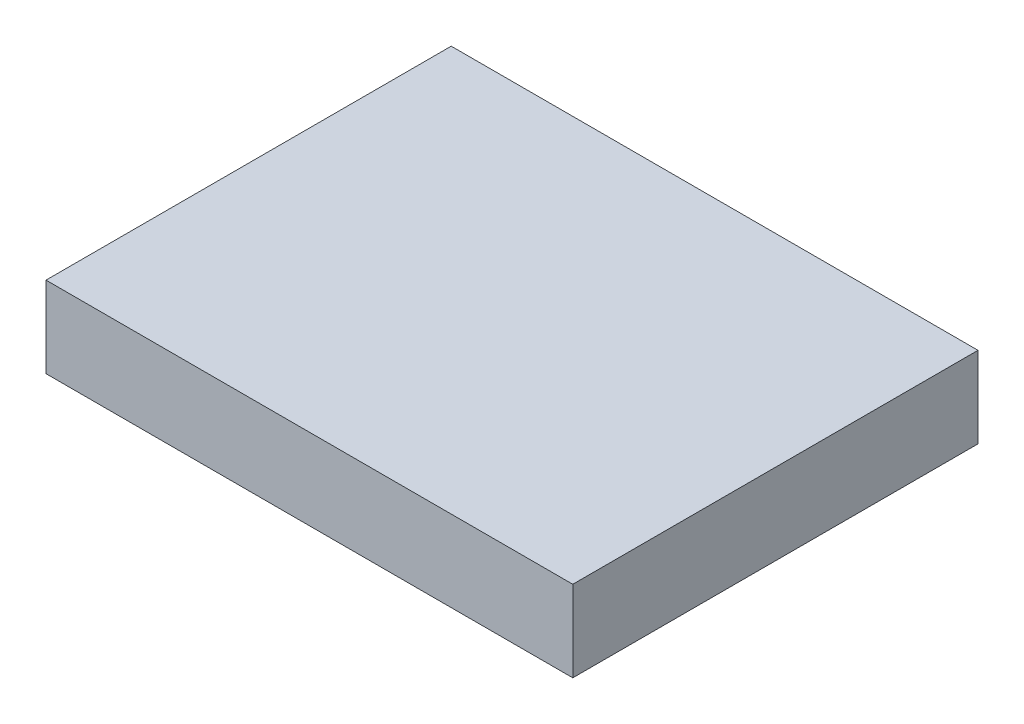
ISO-10303-21;
HEADER;
FILE_DESCRIPTION(('STEP AP214'),'2;1');
FILE_NAME('part.step','',(''),(''),'','','');
FILE_SCHEMA(('AUTOMOTIVE_DESIGN { 1 0 10303 214 1 1 1 1 }'));
ENDSEC;
DATA;
#1=APPLICATION_CONTEXT('core data for automotive mechanical design processes');
#2=APPLICATION_PROTOCOL_DEFINITION('international standard','automotive_design',2000,#1);
#3=PRODUCT_CONTEXT('',#1,'mechanical');
#4=PRODUCT('Part','Part','',(#3));
#5=PRODUCT_RELATED_PRODUCT_CATEGORY('part','',(#4));
#6=PRODUCT_DEFINITION_FORMATION('','',#4);
#7=PRODUCT_DEFINITION_CONTEXT('part definition',#1,'design');
#8=PRODUCT_DEFINITION('design','',#6,#7);
#9=PRODUCT_DEFINITION_SHAPE('','',#8);
#10=(LENGTH_UNIT() NAMED_UNIT(*) SI_UNIT(.MILLI.,.METRE.));
#11=(NAMED_UNIT(*) PLANE_ANGLE_UNIT() SI_UNIT($,.RADIAN.));
#12=(NAMED_UNIT(*) SI_UNIT($,.STERADIAN.) SOLID_ANGLE_UNIT());
#13=UNCERTAINTY_MEASURE_WITH_UNIT(LENGTH_MEASURE(1.E-05),#10,'distance_accuracy_value','');
#14=(GEOMETRIC_REPRESENTATION_CONTEXT(3) GLOBAL_UNCERTAINTY_ASSIGNED_CONTEXT((#13)) GLOBAL_UNIT_ASSIGNED_CONTEXT((#10,
#11,#12)) REPRESENTATION_CONTEXT('',''));
#15=CARTESIAN_POINT('',(0.,0.,0.));
#16=DIRECTION('',(0.,0.,1.));
#17=DIRECTION('',(1.,0.,0.));
#18=AXIS2_PLACEMENT_3D('',#15,#16,#17);
#19=CARTESIAN_POINT('',(0.,50.8,-254.));
#20=DIRECTION('',(0.,0.,-1.));
#21=DIRECTION('',(-1.,0.,0.));
#22=AXIS2_PLACEMENT_3D('',#19,#20,#21);
#23=PLANE('',#22);
#24=DIRECTION('',(1.,0.,0.));
#25=VECTOR('',#24,1.);
#26=CARTESIAN_POINT('',(0.,0.,-254.));
#27=LINE('',#26,#25);
#28=CARTESIAN_POINT('',(0.,0.,-254.));
#29=VERTEX_POINT('',#28);
#30=CARTESIAN_POINT('',(330.2,0.,-254.));
#31=VERTEX_POINT('',#30);
#32=EDGE_CURVE('E109',#29,#31,#27,.T.);
#33=ORIENTED_EDGE('',*,*,#32,.F.);
#34=DIRECTION('',(0.,-1.,0.));
#35=VECTOR('',#34,1.);
#36=CARTESIAN_POINT('',(0.,50.8,-254.));
#37=LINE('',#36,#35);
#38=CARTESIAN_POINT('',(0.,50.8,-254.));
#39=VERTEX_POINT('',#38);
#40=EDGE_CURVE('E11',#39,#29,#37,.T.);
#41=ORIENTED_EDGE('',*,*,#40,.F.);
#42=DIRECTION('',(1.,0.,0.));
#43=VECTOR('',#42,1.);
#44=CARTESIAN_POINT('',(0.,50.8,-254.));
#45=LINE('',#44,#43);
#46=CARTESIAN_POINT('',(330.2,50.8,-254.));
#47=VERTEX_POINT('',#46);
#48=EDGE_CURVE('E103',#39,#47,#45,.T.);
#49=ORIENTED_EDGE('',*,*,#48,.T.);
#50=DIRECTION('',(0.,-1.,0.));
#51=VECTOR('',#50,1.);
#52=CARTESIAN_POINT('',(330.2,50.8,-254.));
#53=LINE('',#52,#51);
#54=EDGE_CURVE('E61',#47,#31,#53,.T.);
#55=ORIENTED_EDGE('',*,*,#54,.T.);
#56=EDGE_LOOP('',(#33,#41,#49,#55));
#57=FACE_BOUND('',#56,.T.);
#58=ADVANCED_FACE('F45',(#57),#23,.T.);
#59=CARTESIAN_POINT('',(0.,50.8,0.));
#60=DIRECTION('',(-1.,0.,0.));
#61=DIRECTION('',(0.,0.,1.));
#62=AXIS2_PLACEMENT_3D('',#59,#60,#61);
#63=PLANE('',#62);
#64=DIRECTION('',(0.,0.,-1.));
#65=VECTOR('',#64,1.);
#66=CARTESIAN_POINT('',(0.,0.,0.));
#67=LINE('',#66,#65);
#68=CARTESIAN_POINT('',(0.,0.,0.));
#69=VERTEX_POINT('',#68);
#70=EDGE_CURVE('E93',#69,#29,#67,.T.);
#71=ORIENTED_EDGE('',*,*,#70,.F.);
#72=DIRECTION('',(0.,-1.,0.));
#73=VECTOR('',#72,1.);
#74=CARTESIAN_POINT('',(0.,50.8,0.));
#75=LINE('',#74,#73);
#76=CARTESIAN_POINT('',(0.,50.8,0.));
#77=VERTEX_POINT('',#76);
#78=EDGE_CURVE('E53',#77,#69,#75,.T.);
#79=ORIENTED_EDGE('',*,*,#78,.F.);
#80=DIRECTION('',(0.,0.,-1.));
#81=VECTOR('',#80,1.);
#82=CARTESIAN_POINT('',(0.,50.8,0.));
#83=LINE('',#82,#81);
#84=EDGE_CURVE('E91',#77,#39,#83,.T.);
#85=ORIENTED_EDGE('',*,*,#84,.T.);
#86=ORIENTED_EDGE('',*,*,#40,.T.);
#87=EDGE_LOOP('',(#71,#79,#85,#86));
#88=FACE_BOUND('',#87,.T.);
#89=ADVANCED_FACE('F89',(#88),#63,.T.);
#90=CARTESIAN_POINT('',(0.,50.8,0.));
#91=DIRECTION('',(0.,0.,-1.));
#92=DIRECTION('',(-1.,0.,0.));
#93=AXIS2_PLACEMENT_3D('',#90,#91,#92);
#94=PLANE('',#93);
#95=DIRECTION('',(1.,0.,0.));
#96=VECTOR('',#95,1.);
#97=CARTESIAN_POINT('',(0.,0.,0.));
#98=LINE('',#97,#96);
#99=CARTESIAN_POINT('',(330.2,0.,0.));
#100=VERTEX_POINT('',#99);
#101=EDGE_CURVE('E112',#69,#100,#98,.T.);
#102=ORIENTED_EDGE('',*,*,#101,.T.);
#103=DIRECTION('',(0.,-1.,0.));
#104=VECTOR('',#103,1.);
#105=CARTESIAN_POINT('',(330.2,50.8,0.));
#106=LINE('',#105,#104);
#107=CARTESIAN_POINT('',(330.2,50.8,0.));
#108=VERTEX_POINT('',#107);
#109=EDGE_CURVE('E75',#108,#100,#106,.T.);
#110=ORIENTED_EDGE('',*,*,#109,.F.);
#111=DIRECTION('',(1.,0.,0.));
#112=VECTOR('',#111,1.);
#113=CARTESIAN_POINT('',(0.,50.8,0.));
#114=LINE('',#113,#112);
#115=EDGE_CURVE('E96',#77,#108,#114,.T.);
#116=ORIENTED_EDGE('',*,*,#115,.F.);
#117=ORIENTED_EDGE('',*,*,#78,.T.);
#118=EDGE_LOOP('',(#102,#110,#116,#117));
#119=FACE_BOUND('',#118,.T.);
#120=ADVANCED_FACE('F97',(#119),#94,.F.);
#121=CARTESIAN_POINT('',(330.2,50.8,-3.60822483003176E-13));
#122=DIRECTION('',(1.,0.,0.));
#123=DIRECTION('',(0.,0.,-1.));
#124=AXIS2_PLACEMENT_3D('',#121,#122,#123);
#125=PLANE('',#124);
#126=DIRECTION('',(0.,0.,1.));
#127=VECTOR('',#126,1.);
#128=CARTESIAN_POINT('',(330.2,0.,-3.60822483003176E-13));
#129=LINE('',#128,#127);
#130=EDGE_CURVE('E105',#31,#100,#129,.T.);
#131=ORIENTED_EDGE('',*,*,#130,.F.);
#132=ORIENTED_EDGE('',*,*,#54,.F.);
#133=DIRECTION('',(0.,0.,1.));
#134=VECTOR('',#133,1.);
#135=CARTESIAN_POINT('',(330.2,50.8,-3.60822483003176E-13));
#136=LINE('',#135,#134);
#137=EDGE_CURVE('E100',#47,#108,#136,.T.);
#138=ORIENTED_EDGE('',*,*,#137,.T.);
#139=ORIENTED_EDGE('',*,*,#109,.T.);
#140=EDGE_LOOP('',(#131,#132,#138,#139));
#141=FACE_BOUND('',#140,.T.);
#142=ADVANCED_FACE('F119',(#141),#125,.T.);
#143=CARTESIAN_POINT('',(0.,50.8,0.));
#144=DIRECTION('',(0.,1.,0.));
#145=DIRECTION('',(0.,0.,1.));
#146=AXIS2_PLACEMENT_3D('',#143,#144,#145);
#147=PLANE('',#146);
#148=ORIENTED_EDGE('',*,*,#48,.F.);
#149=ORIENTED_EDGE('',*,*,#84,.F.);
#150=ORIENTED_EDGE('',*,*,#115,.T.);
#151=ORIENTED_EDGE('',*,*,#137,.F.);
#152=EDGE_LOOP('',(#148,#149,#150,#151));
#153=FACE_BOUND('',#152,.T.);
#154=ADVANCED_FACE('F102',(#153),#147,.T.);
#155=CARTESIAN_POINT('',(0.,0.,0.));
#156=DIRECTION('',(0.,1.,0.));
#157=DIRECTION('',(0.,0.,1.));
#158=AXIS2_PLACEMENT_3D('',#155,#156,#157);
#159=PLANE('',#158);
#160=ORIENTED_EDGE('',*,*,#32,.T.);
#161=ORIENTED_EDGE('',*,*,#130,.T.);
#162=ORIENTED_EDGE('',*,*,#101,.F.);
#163=ORIENTED_EDGE('',*,*,#70,.T.);
#164=EDGE_LOOP('',(#160,#161,#162,#163));
#165=FACE_BOUND('',#164,.T.);
#166=ADVANCED_FACE('F118',(#165),#159,.F.);
#167=CLOSED_SHELL('',(#58,#89,#120,#142,#154,#166));
#168=MANIFOLD_SOLID_BREP('B2',#167);
#169=ADVANCED_BREP_SHAPE_REPRESENTATION('',(#18,#168),#14);
#170=SHAPE_DEFINITION_REPRESENTATION(#9,#169);
ENDSEC;
END-ISO-10303-21;
